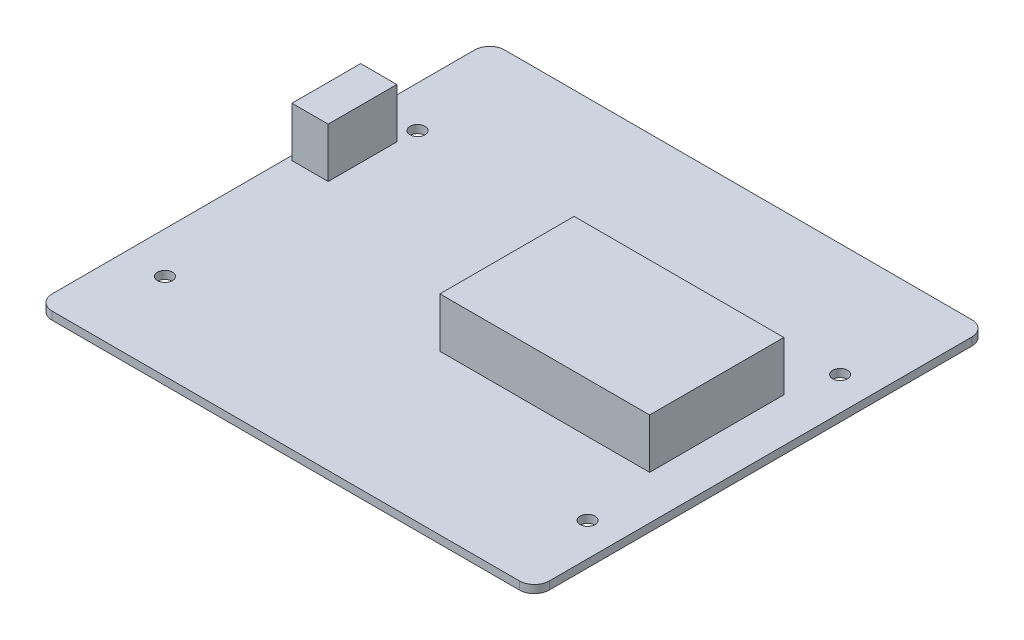
ISO-10303-21;
HEADER;
FILE_DESCRIPTION(('STEP AP214'),'2;1');
FILE_NAME('part.step','',(''),(''),'','','');
FILE_SCHEMA(('AUTOMOTIVE_DESIGN { 1 0 10303 214 1 1 1 1 }'));
ENDSEC;
DATA;
#1=APPLICATION_CONTEXT('core data for automotive mechanical design processes');
#2=APPLICATION_PROTOCOL_DEFINITION('international standard','automotive_design',2000,#1);
#3=PRODUCT_CONTEXT('',#1,'mechanical');
#4=PRODUCT('Part','Part','',(#3));
#5=PRODUCT_RELATED_PRODUCT_CATEGORY('part','',(#4));
#6=PRODUCT_DEFINITION_FORMATION('','',#4);
#7=PRODUCT_DEFINITION_CONTEXT('part definition',#1,'design');
#8=PRODUCT_DEFINITION('design','',#6,#7);
#9=PRODUCT_DEFINITION_SHAPE('','',#8);
#10=(LENGTH_UNIT() NAMED_UNIT(*) SI_UNIT(.MILLI.,.METRE.));
#11=(NAMED_UNIT(*) PLANE_ANGLE_UNIT() SI_UNIT($,.RADIAN.));
#12=(NAMED_UNIT(*) SI_UNIT($,.STERADIAN.) SOLID_ANGLE_UNIT());
#13=UNCERTAINTY_MEASURE_WITH_UNIT(LENGTH_MEASURE(1.E-05),#10,'distance_accuracy_value','');
#14=(GEOMETRIC_REPRESENTATION_CONTEXT(3) GLOBAL_UNCERTAINTY_ASSIGNED_CONTEXT((#13)) GLOBAL_UNIT_ASSIGNED_CONTEXT((#10,
#11,#12)) REPRESENTATION_CONTEXT('',''));
#15=CARTESIAN_POINT('',(0.,0.,0.));
#16=DIRECTION('',(0.,0.,1.));
#17=DIRECTION('',(1.,0.,0.));
#18=AXIS2_PLACEMENT_3D('',#15,#16,#17);
#19=CARTESIAN_POINT('',(47.,1.6,42.5));
#20=DIRECTION('',(0.,1.,0.));
#21=DIRECTION('',(0.,0.,1.));
#22=AXIS2_PLACEMENT_3D('',#19,#20,#21);
#23=PLANE('',#22);
#24=CARTESIAN_POINT('',(43.3,1.6,28.1));
#25=DIRECTION('',(0.,1.,0.));
#26=DIRECTION('',(0.,0.,1.));
#27=AXIS2_PLACEMENT_3D('',#24,#25,#26);
#28=CIRCLE('',#27,1.5);
#29=CARTESIAN_POINT('',(43.3,1.6,29.6));
#30=VERTEX_POINT('',#29);
#31=EDGE_CURVE('E213',#30,#30,#28,.T.);
#32=ORIENTED_EDGE('',*,*,#31,.F.);
#33=EDGE_LOOP('',(#32));
#34=FACE_BOUND('',#33,.T.);
#35=CARTESIAN_POINT('',(-41.7,1.6,-22.7));
#36=DIRECTION('',(0.,1.,0.));
#37=DIRECTION('',(0.,0.,1.));
#38=AXIS2_PLACEMENT_3D('',#35,#36,#37);
#39=CIRCLE('',#38,1.5);
#40=CARTESIAN_POINT('',(-41.7,1.6,-21.2));
#41=VERTEX_POINT('',#40);
#42=EDGE_CURVE('E225',#41,#41,#39,.T.);
#43=ORIENTED_EDGE('',*,*,#42,.F.);
#44=EDGE_LOOP('',(#43));
#45=FACE_BOUND('',#44,.T.);
#46=CARTESIAN_POINT('',(47.,1.6,42.5));
#47=DIRECTION('',(0.,1.,0.));
#48=DIRECTION('',(0.,0.,1.));
#49=AXIS2_PLACEMENT_3D('',#46,#47,#48);
#50=CIRCLE('',#49,3.);
#51=CARTESIAN_POINT('',(47.,1.6,45.5));
#52=VERTEX_POINT('',#51);
#53=CARTESIAN_POINT('',(50.,1.6,42.5));
#54=VERTEX_POINT('',#53);
#55=EDGE_CURVE('E231',#52,#54,#50,.T.);
#56=ORIENTED_EDGE('',*,*,#55,.T.);
#57=DIRECTION('',(0.,0.,-1.));
#58=VECTOR('',#57,1.);
#59=CARTESIAN_POINT('',(50.,1.6,-42.5));
#60=LINE('',#59,#58);
#61=CARTESIAN_POINT('',(50.,1.6,-42.5));
#62=VERTEX_POINT('',#61);
#63=EDGE_CURVE('E234',#54,#62,#60,.T.);
#64=ORIENTED_EDGE('',*,*,#63,.T.);
#65=CARTESIAN_POINT('',(47.,1.6,-42.5));
#66=DIRECTION('',(0.,1.,0.));
#67=DIRECTION('',(0.,0.,-1.));
#68=AXIS2_PLACEMENT_3D('',#65,#66,#67);
#69=CIRCLE('',#68,3.);
#70=CARTESIAN_POINT('',(47.,1.6,-45.5));
#71=VERTEX_POINT('',#70);
#72=EDGE_CURVE('E237',#62,#71,#69,.T.);
#73=ORIENTED_EDGE('',*,*,#72,.T.);
#74=DIRECTION('',(-1.,0.,0.));
#75=VECTOR('',#74,1.);
#76=CARTESIAN_POINT('',(-47.,1.6,-45.5));
#77=LINE('',#76,#75);
#78=CARTESIAN_POINT('',(-47.,1.6,-45.5));
#79=VERTEX_POINT('',#78);
#80=EDGE_CURVE('E239',#71,#79,#77,.T.);
#81=ORIENTED_EDGE('',*,*,#80,.T.);
#82=CARTESIAN_POINT('',(-47.,1.6,-42.5));
#83=DIRECTION('',(0.,1.,0.));
#84=DIRECTION('',(0.,0.,1.));
#85=AXIS2_PLACEMENT_3D('',#82,#83,#84);
#86=CIRCLE('',#85,3.);
#87=CARTESIAN_POINT('',(-50.,1.6,-42.5));
#88=VERTEX_POINT('',#87);
#89=EDGE_CURVE('E241',#79,#88,#86,.T.);
#90=ORIENTED_EDGE('',*,*,#89,.T.);
#91=DIRECTION('',(0.,0.,1.));
#92=VECTOR('',#91,1.);
#93=CARTESIAN_POINT('',(-50.,1.6,-42.5));
#94=LINE('',#93,#92);
#95=CARTESIAN_POINT('',(-50.,1.6,42.5));
#96=VERTEX_POINT('',#95);
#97=EDGE_CURVE('E243',#88,#96,#94,.T.);
#98=ORIENTED_EDGE('',*,*,#97,.T.);
#99=CARTESIAN_POINT('',(-47.,1.6,42.5));
#100=DIRECTION('',(0.,1.,0.));
#101=DIRECTION('',(0.,0.,1.));
#102=AXIS2_PLACEMENT_3D('',#99,#100,#101);
#103=CIRCLE('',#102,3.00000000000001);
#104=CARTESIAN_POINT('',(-47.,1.6,45.5));
#105=VERTEX_POINT('',#104);
#106=EDGE_CURVE('E245',#96,#105,#103,.T.);
#107=ORIENTED_EDGE('',*,*,#106,.T.);
#108=DIRECTION('',(1.,0.,0.));
#109=VECTOR('',#108,1.);
#110=CARTESIAN_POINT('',(-47.,1.6,45.5));
#111=LINE('',#110,#109);
#112=EDGE_CURVE('E247',#105,#52,#111,.T.);
#113=ORIENTED_EDGE('',*,*,#112,.T.);
#114=EDGE_LOOP('',(#56,#64,#73,#81,#90,#98,#107,#113));
#115=FACE_BOUND('',#114,.T.);
#116=CARTESIAN_POINT('',(43.3,1.6,-22.7));
#117=DIRECTION('',(0.,1.,0.));
#118=DIRECTION('',(0.,0.,1.));
#119=AXIS2_PLACEMENT_3D('',#116,#117,#118);
#120=CIRCLE('',#119,1.5);
#121=CARTESIAN_POINT('',(43.3,1.6,-21.2));
#122=VERTEX_POINT('',#121);
#123=EDGE_CURVE('E219',#122,#122,#120,.T.);
#124=ORIENTED_EDGE('',*,*,#123,.F.);
#125=EDGE_LOOP('',(#124));
#126=FACE_BOUND('',#125,.T.);
#127=CARTESIAN_POINT('',(-41.7,1.6,28.1));
#128=DIRECTION('',(0.,1.,0.));
#129=DIRECTION('',(0.,0.,1.));
#130=AXIS2_PLACEMENT_3D('',#127,#128,#129);
#131=CIRCLE('',#130,1.5);
#132=CARTESIAN_POINT('',(-41.7,1.6,29.6));
#133=VERTEX_POINT('',#132);
#134=EDGE_CURVE('E207',#133,#133,#131,.T.);
#135=ORIENTED_EDGE('',*,*,#134,.F.);
#136=EDGE_LOOP('',(#135));
#137=FACE_BOUND('',#136,.T.);
#138=DIRECTION('',(-1.,0.,0.));
#139=VECTOR('',#138,1.);
#140=CARTESIAN_POINT('',(-1.00444099512781,1.6,-13.4971758720303));
#141=LINE('',#140,#139);
#142=CARTESIAN_POINT('',(41.1820808002414,1.6,-13.4971758720303));
#143=VERTEX_POINT('',#142);
#144=CARTESIAN_POINT('',(-1.00444099512781,1.6,-13.4971758720303));
#145=VERTEX_POINT('',#144);
#146=EDGE_CURVE('E178',#143,#145,#141,.T.);
#147=ORIENTED_EDGE('',*,*,#146,.F.);
#148=DIRECTION('',(0.,0.,-1.));
#149=VECTOR('',#148,1.);
#150=CARTESIAN_POINT('',(41.1820808002414,1.6,-13.4971758720303));
#151=LINE('',#150,#149);
#152=CARTESIAN_POINT('',(41.1820808002414,1.6,13.4971758720303));
#153=VERTEX_POINT('',#152);
#154=EDGE_CURVE('E175',#153,#143,#151,.T.);
#155=ORIENTED_EDGE('',*,*,#154,.F.);
#156=DIRECTION('',(1.,0.,0.));
#157=VECTOR('',#156,1.);
#158=CARTESIAN_POINT('',(-1.00444099512781,1.6,13.4971758720303));
#159=LINE('',#158,#157);
#160=CARTESIAN_POINT('',(-1.00444099512781,1.6,13.4971758720303));
#161=VERTEX_POINT('',#160);
#162=EDGE_CURVE('E187',#161,#153,#159,.T.);
#163=ORIENTED_EDGE('',*,*,#162,.F.);
#164=DIRECTION('',(0.,0.,1.));
#165=VECTOR('',#164,1.);
#166=CARTESIAN_POINT('',(-1.00444099512781,1.6,-13.4971758720303));
#167=LINE('',#166,#165);
#168=EDGE_CURVE('E195',#145,#161,#167,.T.);
#169=ORIENTED_EDGE('',*,*,#168,.F.);
#170=EDGE_LOOP('',(#147,#155,#163,#169));
#171=FACE_BOUND('',#170,.T.);
#172=DIRECTION('',(-1.,0.,0.));
#173=VECTOR('',#172,1.);
#174=CARTESIAN_POINT('',(-49.0920536368732,1.6,-18.6449359720605));
#175=LINE('',#174,#173);
#176=CARTESIAN_POINT('',(-41.8098564221964,1.6,-18.6449359720605));
#177=VERTEX_POINT('',#176);
#178=CARTESIAN_POINT('',(-49.0920536368732,1.6,-18.6449359720605));
#179=VERTEX_POINT('',#178);
#180=EDGE_CURVE('E554',#177,#179,#175,.T.);
#181=ORIENTED_EDGE('',*,*,#180,.F.);
#182=DIRECTION('',(0.,0.,-1.));
#183=VECTOR('',#182,1.);
#184=CARTESIAN_POINT('',(-41.8098564221964,1.6,-18.6449359720605));
#185=LINE('',#184,#183);
#186=CARTESIAN_POINT('',(-41.8098564221964,1.6,-4.83387228905275));
#187=VERTEX_POINT('',#186);
#188=EDGE_CURVE('E173',#187,#177,#185,.T.);
#189=ORIENTED_EDGE('',*,*,#188,.F.);
#190=DIRECTION('',(1.,0.,0.));
#191=VECTOR('',#190,1.);
#192=CARTESIAN_POINT('',(-49.0920536368732,1.6,-4.83387228905275));
#193=LINE('',#192,#191);
#194=CARTESIAN_POINT('',(-49.0920536368732,1.6,-4.83387228905274));
#195=VERTEX_POINT('',#194);
#196=EDGE_CURVE('E169',#195,#187,#193,.T.);
#197=ORIENTED_EDGE('',*,*,#196,.F.);
#198=DIRECTION('',(0.,0.,1.));
#199=VECTOR('',#198,1.);
#200=CARTESIAN_POINT('',(-49.0920536368732,1.6,-18.6449359720605));
#201=LINE('',#200,#199);
#202=EDGE_CURVE('E551',#179,#195,#201,.T.);
#203=ORIENTED_EDGE('',*,*,#202,.F.);
#204=EDGE_LOOP('',(#181,#189,#197,#203));
#205=FACE_BOUND('',#204,.T.);
#206=ADVANCED_FACE('F36',(#34,#45,#115,#126,#137,#171,#205),#23,.T.);
#207=CARTESIAN_POINT('',(47.,0.,42.5));
#208=DIRECTION('',(0.,1.,0.));
#209=DIRECTION('',(0.,0.,1.));
#210=AXIS2_PLACEMENT_3D('',#207,#208,#209);
#211=PLANE('',#210);
#212=CARTESIAN_POINT('',(47.,0.,42.5));
#213=DIRECTION('',(0.,1.,0.));
#214=DIRECTION('',(0.,0.,1.));
#215=AXIS2_PLACEMENT_3D('',#212,#213,#214);
#216=CIRCLE('',#215,3.);
#217=CARTESIAN_POINT('',(47.,0.,45.5));
#218=VERTEX_POINT('',#217);
#219=CARTESIAN_POINT('',(50.,0.,42.5));
#220=VERTEX_POINT('',#219);
#221=EDGE_CURVE('E228',#218,#220,#216,.T.);
#222=ORIENTED_EDGE('',*,*,#221,.F.);
#223=DIRECTION('',(1.,0.,0.));
#224=VECTOR('',#223,1.);
#225=CARTESIAN_POINT('',(-47.,0.,45.5));
#226=LINE('',#225,#224);
#227=CARTESIAN_POINT('',(-47.,0.,45.5));
#228=VERTEX_POINT('',#227);
#229=EDGE_CURVE('E235',#228,#218,#226,.T.);
#230=ORIENTED_EDGE('',*,*,#229,.F.);
#231=CARTESIAN_POINT('',(-47.,0.,42.5));
#232=DIRECTION('',(0.,1.,0.));
#233=DIRECTION('',(0.,0.,1.));
#234=AXIS2_PLACEMENT_3D('',#231,#232,#233);
#235=CIRCLE('',#234,3.00000000000001);
#236=CARTESIAN_POINT('',(-50.,0.,42.5));
#237=VERTEX_POINT('',#236);
#238=EDGE_CURVE('E262',#237,#228,#235,.T.);
#239=ORIENTED_EDGE('',*,*,#238,.F.);
#240=DIRECTION('',(0.,0.,1.));
#241=VECTOR('',#240,1.);
#242=CARTESIAN_POINT('',(-50.,0.,-42.5));
#243=LINE('',#242,#241);
#244=CARTESIAN_POINT('',(-50.,0.,-42.5));
#245=VERTEX_POINT('',#244);
#246=EDGE_CURVE('E260',#245,#237,#243,.T.);
#247=ORIENTED_EDGE('',*,*,#246,.F.);
#248=CARTESIAN_POINT('',(-47.,0.,-42.5));
#249=DIRECTION('',(0.,1.,0.));
#250=DIRECTION('',(0.,0.,1.));
#251=AXIS2_PLACEMENT_3D('',#248,#249,#250);
#252=CIRCLE('',#251,3.);
#253=CARTESIAN_POINT('',(-47.,0.,-45.5));
#254=VERTEX_POINT('',#253);
#255=EDGE_CURVE('E258',#254,#245,#252,.T.);
#256=ORIENTED_EDGE('',*,*,#255,.F.);
#257=DIRECTION('',(-1.,0.,0.));
#258=VECTOR('',#257,1.);
#259=CARTESIAN_POINT('',(-47.,0.,-45.5));
#260=LINE('',#259,#258);
#261=CARTESIAN_POINT('',(47.,0.,-45.5));
#262=VERTEX_POINT('',#261);
#263=EDGE_CURVE('E256',#262,#254,#260,.T.);
#264=ORIENTED_EDGE('',*,*,#263,.F.);
#265=CARTESIAN_POINT('',(47.,0.,-42.5));
#266=DIRECTION('',(0.,1.,0.));
#267=DIRECTION('',(0.,0.,-1.));
#268=AXIS2_PLACEMENT_3D('',#265,#266,#267);
#269=CIRCLE('',#268,3.);
#270=CARTESIAN_POINT('',(50.,0.,-42.5));
#271=VERTEX_POINT('',#270);
#272=EDGE_CURVE('E254',#271,#262,#269,.T.);
#273=ORIENTED_EDGE('',*,*,#272,.F.);
#274=DIRECTION('',(0.,0.,-1.));
#275=VECTOR('',#274,1.);
#276=CARTESIAN_POINT('',(50.,0.,-42.5));
#277=LINE('',#276,#275);
#278=EDGE_CURVE('E252',#220,#271,#277,.T.);
#279=ORIENTED_EDGE('',*,*,#278,.F.);
#280=EDGE_LOOP('',(#222,#230,#239,#247,#256,#264,#273,#279));
#281=FACE_BOUND('',#280,.T.);
#282=CARTESIAN_POINT('',(-41.7,0.,-22.7));
#283=DIRECTION('',(0.,1.,0.));
#284=DIRECTION('',(0.,0.,1.));
#285=AXIS2_PLACEMENT_3D('',#282,#283,#284);
#286=CIRCLE('',#285,1.5);
#287=CARTESIAN_POINT('',(-41.7,0.,-21.2));
#288=VERTEX_POINT('',#287);
#289=EDGE_CURVE('E222',#288,#288,#286,.T.);
#290=ORIENTED_EDGE('',*,*,#289,.T.);
#291=EDGE_LOOP('',(#290));
#292=FACE_BOUND('',#291,.T.);
#293=CARTESIAN_POINT('',(43.3,0.,-22.7));
#294=DIRECTION('',(0.,1.,0.));
#295=DIRECTION('',(0.,0.,1.));
#296=AXIS2_PLACEMENT_3D('',#293,#294,#295);
#297=CIRCLE('',#296,1.5);
#298=CARTESIAN_POINT('',(43.3,0.,-21.2));
#299=VERTEX_POINT('',#298);
#300=EDGE_CURVE('E216',#299,#299,#297,.T.);
#301=ORIENTED_EDGE('',*,*,#300,.T.);
#302=EDGE_LOOP('',(#301));
#303=FACE_BOUND('',#302,.T.);
#304=CARTESIAN_POINT('',(43.3,0.,28.1));
#305=DIRECTION('',(0.,1.,0.));
#306=DIRECTION('',(0.,0.,1.));
#307=AXIS2_PLACEMENT_3D('',#304,#305,#306);
#308=CIRCLE('',#307,1.5);
#309=CARTESIAN_POINT('',(43.3,0.,29.6));
#310=VERTEX_POINT('',#309);
#311=EDGE_CURVE('E210',#310,#310,#308,.T.);
#312=ORIENTED_EDGE('',*,*,#311,.T.);
#313=EDGE_LOOP('',(#312));
#314=FACE_BOUND('',#313,.T.);
#315=CARTESIAN_POINT('',(-41.7,0.,28.1));
#316=DIRECTION('',(0.,1.,0.));
#317=DIRECTION('',(0.,0.,1.));
#318=AXIS2_PLACEMENT_3D('',#315,#316,#317);
#319=CIRCLE('',#318,1.5);
#320=CARTESIAN_POINT('',(-41.7,0.,29.6));
#321=VERTEX_POINT('',#320);
#322=EDGE_CURVE('E206',#321,#321,#319,.T.);
#323=ORIENTED_EDGE('',*,*,#322,.T.);
#324=EDGE_LOOP('',(#323));
#325=FACE_BOUND('',#324,.T.);
#326=ADVANCED_FACE('F292',(#281,#292,#303,#314,#325),#211,.F.);
#327=CARTESIAN_POINT('',(47.,1.6,42.5));
#328=DIRECTION('',(0.,-1.,0.));
#329=DIRECTION('',(0.,0.,-1.));
#330=AXIS2_PLACEMENT_3D('',#327,#328,#329);
#331=CYLINDRICAL_SURFACE('',#330,3.);
#332=ORIENTED_EDGE('',*,*,#221,.T.);
#333=DIRECTION('',(0.,-1.,0.));
#334=VECTOR('',#333,1.);
#335=CARTESIAN_POINT('',(50.,1.6,42.5));
#336=LINE('',#335,#334);
#337=EDGE_CURVE('E11',#54,#220,#336,.T.);
#338=ORIENTED_EDGE('',*,*,#337,.F.);
#339=ORIENTED_EDGE('',*,*,#55,.F.);
#340=DIRECTION('',(0.,-1.,0.));
#341=VECTOR('',#340,1.);
#342=CARTESIAN_POINT('',(47.,1.6,45.5));
#343=LINE('',#342,#341);
#344=EDGE_CURVE('E249',#52,#218,#343,.T.);
#345=ORIENTED_EDGE('',*,*,#344,.T.);
#346=EDGE_LOOP('',(#332,#338,#339,#345));
#347=FACE_BOUND('',#346,.T.);
#348=ADVANCED_FACE('F38',(#347),#331,.T.);
#349=CARTESIAN_POINT('',(50.,1.6,-42.5));
#350=DIRECTION('',(-1.,0.,0.));
#351=DIRECTION('',(0.,0.,1.));
#352=AXIS2_PLACEMENT_3D('',#349,#350,#351);
#353=PLANE('',#352);
#354=ORIENTED_EDGE('',*,*,#278,.T.);
#355=DIRECTION('',(0.,-1.,0.));
#356=VECTOR('',#355,1.);
#357=CARTESIAN_POINT('',(50.,1.6,-42.5));
#358=LINE('',#357,#356);
#359=EDGE_CURVE('E44',#62,#271,#358,.T.);
#360=ORIENTED_EDGE('',*,*,#359,.F.);
#361=ORIENTED_EDGE('',*,*,#63,.F.);
#362=ORIENTED_EDGE('',*,*,#337,.T.);
#363=EDGE_LOOP('',(#354,#360,#361,#362));
#364=FACE_BOUND('',#363,.T.);
#365=ADVANCED_FACE('F310',(#364),#353,.F.);
#366=CARTESIAN_POINT('',(47.,1.6,-42.5));
#367=DIRECTION('',(0.,-1.,0.));
#368=DIRECTION('',(0.,0.,-1.));
#369=AXIS2_PLACEMENT_3D('',#366,#367,#368);
#370=CYLINDRICAL_SURFACE('',#369,3.);
#371=ORIENTED_EDGE('',*,*,#272,.T.);
#372=DIRECTION('',(0.,-1.,0.));
#373=VECTOR('',#372,1.);
#374=CARTESIAN_POINT('',(47.,1.6,-45.5));
#375=LINE('',#374,#373);
#376=EDGE_CURVE('E279',#71,#262,#375,.T.);
#377=ORIENTED_EDGE('',*,*,#376,.F.);
#378=ORIENTED_EDGE('',*,*,#72,.F.);
#379=ORIENTED_EDGE('',*,*,#359,.T.);
#380=EDGE_LOOP('',(#371,#377,#378,#379));
#381=FACE_BOUND('',#380,.T.);
#382=ADVANCED_FACE('F286',(#381),#370,.T.);
#383=CARTESIAN_POINT('',(-47.,1.6,-45.5));
#384=DIRECTION('',(0.,0.,1.));
#385=DIRECTION('',(1.,0.,0.));
#386=AXIS2_PLACEMENT_3D('',#383,#384,#385);
#387=PLANE('',#386);
#388=ORIENTED_EDGE('',*,*,#263,.T.);
#389=DIRECTION('',(0.,-1.,0.));
#390=VECTOR('',#389,1.);
#391=CARTESIAN_POINT('',(-47.,1.6,-45.5));
#392=LINE('',#391,#390);
#393=EDGE_CURVE('E276',#79,#254,#392,.T.);
#394=ORIENTED_EDGE('',*,*,#393,.F.);
#395=ORIENTED_EDGE('',*,*,#80,.F.);
#396=ORIENTED_EDGE('',*,*,#376,.T.);
#397=EDGE_LOOP('',(#388,#394,#395,#396));
#398=FACE_BOUND('',#397,.T.);
#399=ADVANCED_FACE('F298',(#398),#387,.F.);
#400=CARTESIAN_POINT('',(-47.,1.6,-42.5));
#401=DIRECTION('',(0.,-1.,0.));
#402=DIRECTION('',(0.,0.,-1.));
#403=AXIS2_PLACEMENT_3D('',#400,#401,#402);
#404=CYLINDRICAL_SURFACE('',#403,3.);
#405=ORIENTED_EDGE('',*,*,#255,.T.);
#406=DIRECTION('',(0.,-1.,0.));
#407=VECTOR('',#406,1.);
#408=CARTESIAN_POINT('',(-50.,1.6,-42.5));
#409=LINE('',#408,#407);
#410=EDGE_CURVE('E273',#88,#245,#409,.T.);
#411=ORIENTED_EDGE('',*,*,#410,.F.);
#412=ORIENTED_EDGE('',*,*,#89,.F.);
#413=ORIENTED_EDGE('',*,*,#393,.T.);
#414=EDGE_LOOP('',(#405,#411,#412,#413));
#415=FACE_BOUND('',#414,.T.);
#416=ADVANCED_FACE('F302',(#415),#404,.T.);
#417=CARTESIAN_POINT('',(-50.,1.6,-42.5));
#418=DIRECTION('',(1.,0.,0.));
#419=DIRECTION('',(0.,0.,-1.));
#420=AXIS2_PLACEMENT_3D('',#417,#418,#419);
#421=PLANE('',#420);
#422=ORIENTED_EDGE('',*,*,#246,.T.);
#423=DIRECTION('',(0.,-1.,0.));
#424=VECTOR('',#423,1.);
#425=CARTESIAN_POINT('',(-50.,1.6,42.5));
#426=LINE('',#425,#424);
#427=EDGE_CURVE('E270',#96,#237,#426,.T.);
#428=ORIENTED_EDGE('',*,*,#427,.F.);
#429=ORIENTED_EDGE('',*,*,#97,.F.);
#430=ORIENTED_EDGE('',*,*,#410,.T.);
#431=EDGE_LOOP('',(#422,#428,#429,#430));
#432=FACE_BOUND('',#431,.T.);
#433=ADVANCED_FACE('F323',(#432),#421,.F.);
#434=CARTESIAN_POINT('',(-47.,1.6,42.5));
#435=DIRECTION('',(0.,-1.,0.));
#436=DIRECTION('',(0.,0.,-1.));
#437=AXIS2_PLACEMENT_3D('',#434,#435,#436);
#438=CYLINDRICAL_SURFACE('',#437,3.00000000000001);
#439=ORIENTED_EDGE('',*,*,#238,.T.);
#440=DIRECTION('',(0.,-1.,0.));
#441=VECTOR('',#440,1.);
#442=CARTESIAN_POINT('',(-47.,1.6,45.5));
#443=LINE('',#442,#441);
#444=EDGE_CURVE('E267',#105,#228,#443,.T.);
#445=ORIENTED_EDGE('',*,*,#444,.F.);
#446=ORIENTED_EDGE('',*,*,#106,.F.);
#447=ORIENTED_EDGE('',*,*,#427,.T.);
#448=EDGE_LOOP('',(#439,#445,#446,#447));
#449=FACE_BOUND('',#448,.T.);
#450=ADVANCED_FACE('F321',(#449),#438,.T.);
#451=CARTESIAN_POINT('',(-47.,1.6,45.5));
#452=DIRECTION('',(0.,0.,-1.));
#453=DIRECTION('',(-1.,0.,0.));
#454=AXIS2_PLACEMENT_3D('',#451,#452,#453);
#455=PLANE('',#454);
#456=ORIENTED_EDGE('',*,*,#229,.T.);
#457=ORIENTED_EDGE('',*,*,#344,.F.);
#458=ORIENTED_EDGE('',*,*,#112,.F.);
#459=ORIENTED_EDGE('',*,*,#444,.T.);
#460=EDGE_LOOP('',(#456,#457,#458,#459));
#461=FACE_BOUND('',#460,.T.);
#462=ADVANCED_FACE('F316',(#461),#455,.F.);
#463=CARTESIAN_POINT('',(-41.7,1.6,-22.7));
#464=DIRECTION('',(0.,-1.,0.));
#465=DIRECTION('',(0.,0.,-1.));
#466=AXIS2_PLACEMENT_3D('',#463,#464,#465);
#467=CYLINDRICAL_SURFACE('',#466,1.5);
#468=ORIENTED_EDGE('',*,*,#42,.T.);
#469=EDGE_LOOP('',(#468));
#470=FACE_BOUND('',#469,.T.);
#471=ORIENTED_EDGE('',*,*,#289,.F.);
#472=EDGE_LOOP('',(#471));
#473=FACE_BOUND('',#472,.T.);
#474=ADVANCED_FACE('F342',(#470,#473),#467,.F.);
#475=CARTESIAN_POINT('',(43.3,1.6,-22.7));
#476=DIRECTION('',(0.,-1.,0.));
#477=DIRECTION('',(0.,0.,-1.));
#478=AXIS2_PLACEMENT_3D('',#475,#476,#477);
#479=CYLINDRICAL_SURFACE('',#478,1.5);
#480=ORIENTED_EDGE('',*,*,#123,.T.);
#481=EDGE_LOOP('',(#480));
#482=FACE_BOUND('',#481,.T.);
#483=ORIENTED_EDGE('',*,*,#300,.F.);
#484=EDGE_LOOP('',(#483));
#485=FACE_BOUND('',#484,.T.);
#486=ADVANCED_FACE('F349',(#482,#485),#479,.F.);
#487=CARTESIAN_POINT('',(43.3,1.6,28.1));
#488=DIRECTION('',(0.,-1.,0.));
#489=DIRECTION('',(0.,0.,-1.));
#490=AXIS2_PLACEMENT_3D('',#487,#488,#489);
#491=CYLINDRICAL_SURFACE('',#490,1.5);
#492=ORIENTED_EDGE('',*,*,#31,.T.);
#493=EDGE_LOOP('',(#492));
#494=FACE_BOUND('',#493,.T.);
#495=ORIENTED_EDGE('',*,*,#311,.F.);
#496=EDGE_LOOP('',(#495));
#497=FACE_BOUND('',#496,.T.);
#498=ADVANCED_FACE('F354',(#494,#497),#491,.F.);
#499=CARTESIAN_POINT('',(-41.7,1.6,28.1));
#500=DIRECTION('',(0.,-1.,0.));
#501=DIRECTION('',(0.,0.,-1.));
#502=AXIS2_PLACEMENT_3D('',#499,#500,#501);
#503=CYLINDRICAL_SURFACE('',#502,1.5);
#504=ORIENTED_EDGE('',*,*,#134,.T.);
#505=EDGE_LOOP('',(#504));
#506=FACE_BOUND('',#505,.T.);
#507=ORIENTED_EDGE('',*,*,#322,.F.);
#508=EDGE_LOOP('',(#507));
#509=FACE_BOUND('',#508,.T.);
#510=ADVANCED_FACE('F366',(#506,#509),#503,.F.);
#511=CARTESIAN_POINT('',(41.1820808002414,11.6,-13.4971758720303));
#512=DIRECTION('',(-1.,0.,0.));
#513=DIRECTION('',(0.,0.,1.));
#514=AXIS2_PLACEMENT_3D('',#511,#512,#513);
#515=PLANE('',#514);
#516=ORIENTED_EDGE('',*,*,#154,.T.);
#517=DIRECTION('',(0.,-1.,0.));
#518=VECTOR('',#517,1.);
#519=CARTESIAN_POINT('',(41.1820808002414,11.6,-13.4971758720303));
#520=LINE('',#519,#518);
#521=CARTESIAN_POINT('',(41.1820808002414,11.6,-13.4971758720303));
#522=VERTEX_POINT('',#521);
#523=EDGE_CURVE('E204',#522,#143,#520,.T.);
#524=ORIENTED_EDGE('',*,*,#523,.F.);
#525=DIRECTION('',(0.,0.,-1.));
#526=VECTOR('',#525,1.);
#527=CARTESIAN_POINT('',(41.1820808002414,11.6,-13.4971758720303));
#528=LINE('',#527,#526);
#529=CARTESIAN_POINT('',(41.1820808002414,11.6,13.4971758720303));
#530=VERTEX_POINT('',#529);
#531=EDGE_CURVE('E183',#530,#522,#528,.T.);
#532=ORIENTED_EDGE('',*,*,#531,.F.);
#533=DIRECTION('',(0.,-1.,0.));
#534=VECTOR('',#533,1.);
#535=CARTESIAN_POINT('',(41.1820808002414,11.6,13.4971758720303));
#536=LINE('',#535,#534);
#537=EDGE_CURVE('E192',#530,#153,#536,.T.);
#538=ORIENTED_EDGE('',*,*,#537,.T.);
#539=EDGE_LOOP('',(#516,#524,#532,#538));
#540=FACE_BOUND('',#539,.T.);
#541=ADVANCED_FACE('F368',(#540),#515,.F.);
#542=CARTESIAN_POINT('',(-1.00444099512781,11.6,-13.4971758720303));
#543=DIRECTION('',(0.,0.,1.));
#544=DIRECTION('',(1.,0.,0.));
#545=AXIS2_PLACEMENT_3D('',#542,#543,#544);
#546=PLANE('',#545);
#547=ORIENTED_EDGE('',*,*,#146,.T.);
#548=DIRECTION('',(0.,-1.,0.));
#549=VECTOR('',#548,1.);
#550=CARTESIAN_POINT('',(-1.00444099512781,11.6,-13.4971758720303));
#551=LINE('',#550,#549);
#552=CARTESIAN_POINT('',(-1.00444099512781,11.6,-13.4971758720303));
#553=VERTEX_POINT('',#552);
#554=EDGE_CURVE('E201',#553,#145,#551,.T.);
#555=ORIENTED_EDGE('',*,*,#554,.F.);
#556=DIRECTION('',(-1.,0.,0.));
#557=VECTOR('',#556,1.);
#558=CARTESIAN_POINT('',(-1.00444099512781,11.6,-13.4971758720303));
#559=LINE('',#558,#557);
#560=EDGE_CURVE('E186',#522,#553,#559,.T.);
#561=ORIENTED_EDGE('',*,*,#560,.F.);
#562=ORIENTED_EDGE('',*,*,#523,.T.);
#563=EDGE_LOOP('',(#547,#555,#561,#562));
#564=FACE_BOUND('',#563,.T.);
#565=ADVANCED_FACE('F375',(#564),#546,.F.);
#566=CARTESIAN_POINT('',(-1.00444099512781,11.6,-13.4971758720303));
#567=DIRECTION('',(1.,0.,0.));
#568=DIRECTION('',(0.,0.,-1.));
#569=AXIS2_PLACEMENT_3D('',#566,#567,#568);
#570=PLANE('',#569);
#571=ORIENTED_EDGE('',*,*,#168,.T.);
#572=DIRECTION('',(0.,-1.,0.));
#573=VECTOR('',#572,1.);
#574=CARTESIAN_POINT('',(-1.00444099512781,11.6,13.4971758720303));
#575=LINE('',#574,#573);
#576=CARTESIAN_POINT('',(-1.00444099512781,11.6,13.4971758720303));
#577=VERTEX_POINT('',#576);
#578=EDGE_CURVE('E59',#577,#161,#575,.T.);
#579=ORIENTED_EDGE('',*,*,#578,.F.);
#580=DIRECTION('',(0.,0.,1.));
#581=VECTOR('',#580,1.);
#582=CARTESIAN_POINT('',(-1.00444099512781,11.6,-13.4971758720303));
#583=LINE('',#582,#581);
#584=EDGE_CURVE('E189',#553,#577,#583,.T.);
#585=ORIENTED_EDGE('',*,*,#584,.F.);
#586=ORIENTED_EDGE('',*,*,#554,.T.);
#587=EDGE_LOOP('',(#571,#579,#585,#586));
#588=FACE_BOUND('',#587,.T.);
#589=ADVANCED_FACE('F383',(#588),#570,.F.);
#590=CARTESIAN_POINT('',(-1.00444099512781,11.6,13.4971758720303));
#591=DIRECTION('',(0.,0.,-1.));
#592=DIRECTION('',(-1.,0.,0.));
#593=AXIS2_PLACEMENT_3D('',#590,#591,#592);
#594=PLANE('',#593);
#595=ORIENTED_EDGE('',*,*,#162,.T.);
#596=ORIENTED_EDGE('',*,*,#537,.F.);
#597=DIRECTION('',(1.,0.,0.));
#598=VECTOR('',#597,1.);
#599=CARTESIAN_POINT('',(-1.00444099512781,11.6,13.4971758720303));
#600=LINE('',#599,#598);
#601=EDGE_CURVE('E191',#577,#530,#600,.T.);
#602=ORIENTED_EDGE('',*,*,#601,.F.);
#603=ORIENTED_EDGE('',*,*,#578,.T.);
#604=EDGE_LOOP('',(#595,#596,#602,#603));
#605=FACE_BOUND('',#604,.T.);
#606=ADVANCED_FACE('F387',(#605),#594,.F.);
#607=CARTESIAN_POINT('',(0.,11.6,0.));
#608=DIRECTION('',(0.,1.,0.));
#609=DIRECTION('',(0.,0.,1.));
#610=AXIS2_PLACEMENT_3D('',#607,#608,#609);
#611=PLANE('',#610);
#612=ORIENTED_EDGE('',*,*,#531,.T.);
#613=ORIENTED_EDGE('',*,*,#560,.T.);
#614=ORIENTED_EDGE('',*,*,#584,.T.);
#615=ORIENTED_EDGE('',*,*,#601,.T.);
#616=EDGE_LOOP('',(#612,#613,#614,#615));
#617=FACE_BOUND('',#616,.T.);
#618=ADVANCED_FACE('F391',(#617),#611,.T.);
#619=CARTESIAN_POINT('',(-41.8098564221964,11.6,-18.6449359720605));
#620=DIRECTION('',(-1.,0.,0.));
#621=DIRECTION('',(0.,0.,1.));
#622=AXIS2_PLACEMENT_3D('',#619,#620,#621);
#623=PLANE('',#622);
#624=ORIENTED_EDGE('',*,*,#188,.T.);
#625=DIRECTION('',(0.,-1.,0.));
#626=VECTOR('',#625,1.);
#627=CARTESIAN_POINT('',(-41.8098564221964,11.6,-18.6449359720605));
#628=LINE('',#627,#626);
#629=CARTESIAN_POINT('',(-41.8098564221964,11.6,-18.6449359720605));
#630=VERTEX_POINT('',#629);
#631=EDGE_CURVE('E154',#630,#177,#628,.T.);
#632=ORIENTED_EDGE('',*,*,#631,.F.);
#633=DIRECTION('',(0.,0.,-1.));
#634=VECTOR('',#633,1.);
#635=CARTESIAN_POINT('',(-41.8098564221964,11.6,-18.6449359720605));
#636=LINE('',#635,#634);
#637=CARTESIAN_POINT('',(-41.8098564221964,11.6,-4.83387228905275));
#638=VERTEX_POINT('',#637);
#639=EDGE_CURVE('E161',#638,#630,#636,.T.);
#640=ORIENTED_EDGE('',*,*,#639,.F.);
#641=DIRECTION('',(0.,-1.,0.));
#642=VECTOR('',#641,1.);
#643=CARTESIAN_POINT('',(-41.8098564221964,11.6,-4.83387228905275));
#644=LINE('',#643,#642);
#645=EDGE_CURVE('E548',#638,#187,#644,.T.);
#646=ORIENTED_EDGE('',*,*,#645,.T.);
#647=EDGE_LOOP('',(#624,#632,#640,#646));
#648=FACE_BOUND('',#647,.T.);
#649=ADVANCED_FACE('F171',(#648),#623,.F.);
#650=CARTESIAN_POINT('',(-49.0920536368732,11.6,-18.6449359720605));
#651=DIRECTION('',(0.,0.,1.));
#652=DIRECTION('',(1.,0.,0.));
#653=AXIS2_PLACEMENT_3D('',#650,#651,#652);
#654=PLANE('',#653);
#655=ORIENTED_EDGE('',*,*,#180,.T.);
#656=DIRECTION('',(0.,-1.,0.));
#657=VECTOR('',#656,1.);
#658=CARTESIAN_POINT('',(-49.0920536368732,11.6,-18.6449359720605));
#659=LINE('',#658,#657);
#660=CARTESIAN_POINT('',(-49.0920536368732,11.6,-18.6449359720605));
#661=VERTEX_POINT('',#660);
#662=EDGE_CURVE('E157',#661,#179,#659,.T.);
#663=ORIENTED_EDGE('',*,*,#662,.F.);
#664=DIRECTION('',(-1.,0.,0.));
#665=VECTOR('',#664,1.);
#666=CARTESIAN_POINT('',(-49.0920536368732,11.6,-18.6449359720605));
#667=LINE('',#666,#665);
#668=EDGE_CURVE('E150',#630,#661,#667,.T.);
#669=ORIENTED_EDGE('',*,*,#668,.F.);
#670=ORIENTED_EDGE('',*,*,#631,.T.);
#671=EDGE_LOOP('',(#655,#663,#669,#670));
#672=FACE_BOUND('',#671,.T.);
#673=ADVANCED_FACE('F152',(#672),#654,.F.);
#674=CARTESIAN_POINT('',(-49.0920536368732,11.6,-18.6449359720605));
#675=DIRECTION('',(1.,0.,0.));
#676=DIRECTION('',(0.,0.,-1.));
#677=AXIS2_PLACEMENT_3D('',#674,#675,#676);
#678=PLANE('',#677);
#679=ORIENTED_EDGE('',*,*,#202,.T.);
#680=DIRECTION('',(0.,-1.,0.));
#681=VECTOR('',#680,1.);
#682=CARTESIAN_POINT('',(-49.0920536368732,11.6,-4.83387228905275));
#683=LINE('',#682,#681);
#684=CARTESIAN_POINT('',(-49.0920536368732,11.6,-4.83387228905275));
#685=VERTEX_POINT('',#684);
#686=EDGE_CURVE('E51',#685,#195,#683,.T.);
#687=ORIENTED_EDGE('',*,*,#686,.F.);
#688=DIRECTION('',(0.,0.,1.));
#689=VECTOR('',#688,1.);
#690=CARTESIAN_POINT('',(-49.0920536368732,11.6,-18.6449359720605));
#691=LINE('',#690,#689);
#692=EDGE_CURVE('E160',#661,#685,#691,.T.);
#693=ORIENTED_EDGE('',*,*,#692,.F.);
#694=ORIENTED_EDGE('',*,*,#662,.T.);
#695=EDGE_LOOP('',(#679,#687,#693,#694));
#696=FACE_BOUND('',#695,.T.);
#697=ADVANCED_FACE('F399',(#696),#678,.F.);
#698=CARTESIAN_POINT('',(-49.0920536368732,11.6,-4.83387228905275));
#699=DIRECTION('',(0.,0.,-1.));
#700=DIRECTION('',(-1.,0.,0.));
#701=AXIS2_PLACEMENT_3D('',#698,#699,#700);
#702=PLANE('',#701);
#703=ORIENTED_EDGE('',*,*,#196,.T.);
#704=ORIENTED_EDGE('',*,*,#645,.F.);
#705=DIRECTION('',(1.,0.,0.));
#706=VECTOR('',#705,1.);
#707=CARTESIAN_POINT('',(-49.0920536368732,11.6,-4.83387228905275));
#708=LINE('',#707,#706);
#709=EDGE_CURVE('E165',#685,#638,#708,.T.);
#710=ORIENTED_EDGE('',*,*,#709,.F.);
#711=ORIENTED_EDGE('',*,*,#686,.T.);
#712=EDGE_LOOP('',(#703,#704,#710,#711));
#713=FACE_BOUND('',#712,.T.);
#714=ADVANCED_FACE('F402',(#713),#702,.F.);
#715=CARTESIAN_POINT('',(0.,11.6,0.));
#716=DIRECTION('',(0.,1.,0.));
#717=DIRECTION('',(0.,0.,1.));
#718=AXIS2_PLACEMENT_3D('',#715,#716,#717);
#719=PLANE('',#718);
#720=ORIENTED_EDGE('',*,*,#639,.T.);
#721=ORIENTED_EDGE('',*,*,#668,.T.);
#722=ORIENTED_EDGE('',*,*,#692,.T.);
#723=ORIENTED_EDGE('',*,*,#709,.T.);
#724=EDGE_LOOP('',(#720,#721,#722,#723));
#725=FACE_BOUND('',#724,.T.);
#726=ADVANCED_FACE('F164',(#725),#719,.T.);
#727=CLOSED_SHELL('',(#206,#326,#348,#365,#382,#399,#416,#433,#450,#462,#474,#486,#498,#510,
#541,#565,#589,#606,#618,#649,#673,#697,#714,#726));
#728=MANIFOLD_SOLID_BREP('B2',#727);
#729=ADVANCED_BREP_SHAPE_REPRESENTATION('',(#18,#728),#14);
#730=SHAPE_DEFINITION_REPRESENTATION(#9,#729);
ENDSEC;
END-ISO-10303-21;
